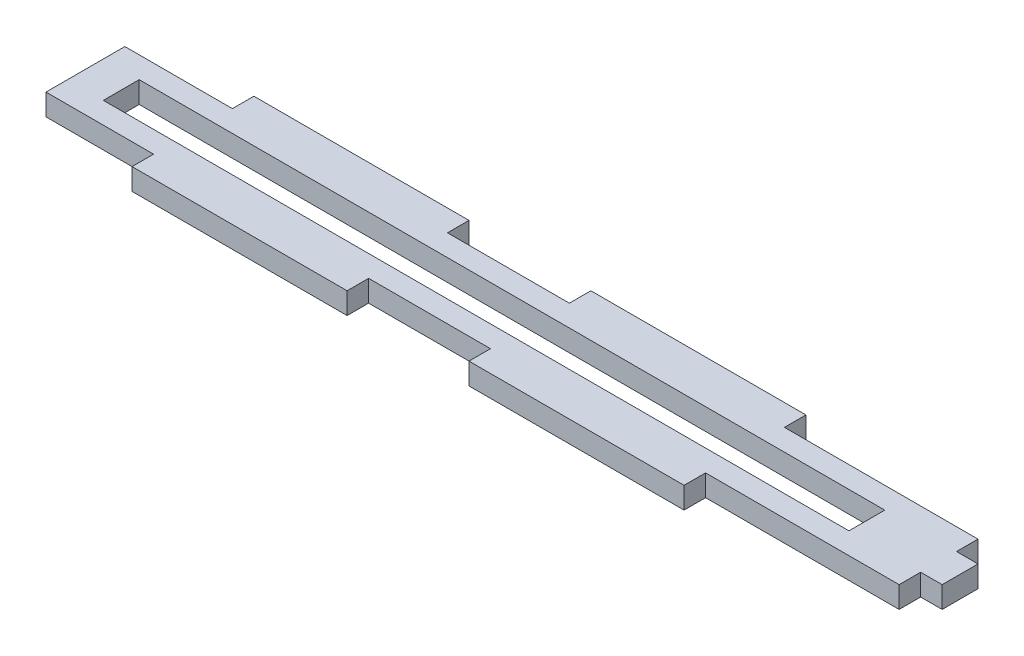
ISO-10303-21;
HEADER;
FILE_DESCRIPTION(('STEP AP214'),'2;1');
FILE_NAME('part.step','',(''),(''),'','','');
FILE_SCHEMA(('AUTOMOTIVE_DESIGN { 1 0 10303 214 1 1 1 1 }'));
ENDSEC;
DATA;
#1=APPLICATION_CONTEXT('core data for automotive mechanical design processes');
#2=APPLICATION_PROTOCOL_DEFINITION('international standard','automotive_design',2000,#1);
#3=PRODUCT_CONTEXT('',#1,'mechanical');
#4=PRODUCT('Part','Part','',(#3));
#5=PRODUCT_RELATED_PRODUCT_CATEGORY('part','',(#4));
#6=PRODUCT_DEFINITION_FORMATION('','',#4);
#7=PRODUCT_DEFINITION_CONTEXT('part definition',#1,'design');
#8=PRODUCT_DEFINITION('design','',#6,#7);
#9=PRODUCT_DEFINITION_SHAPE('','',#8);
#10=(LENGTH_UNIT() NAMED_UNIT(*) SI_UNIT(.MILLI.,.METRE.));
#11=(NAMED_UNIT(*) PLANE_ANGLE_UNIT() SI_UNIT($,.RADIAN.));
#12=(NAMED_UNIT(*) SI_UNIT($,.STERADIAN.) SOLID_ANGLE_UNIT());
#13=UNCERTAINTY_MEASURE_WITH_UNIT(LENGTH_MEASURE(1.E-05),#10,'distance_accuracy_value','');
#14=(GEOMETRIC_REPRESENTATION_CONTEXT(3) GLOBAL_UNCERTAINTY_ASSIGNED_CONTEXT((#13)) GLOBAL_UNIT_ASSIGNED_CONTEXT((#10,
#11,#12)) REPRESENTATION_CONTEXT('',''));
#15=CARTESIAN_POINT('',(0.,0.,0.));
#16=DIRECTION('',(0.,0.,1.));
#17=DIRECTION('',(1.,0.,0.));
#18=AXIS2_PLACEMENT_3D('',#15,#16,#17);
#19=CARTESIAN_POINT('',(59.5,1.5,-5.49999999999999));
#20=DIRECTION('',(-1.,0.,0.));
#21=DIRECTION('',(0.,0.,1.));
#22=AXIS2_PLACEMENT_3D('',#19,#20,#21);
#23=PLANE('',#22);
#24=DIRECTION('',(0.,-1.,0.));
#25=VECTOR('',#24,1.);
#26=CARTESIAN_POINT('',(59.5,1.5,2.49999999999998));
#27=LINE('',#26,#25);
#28=CARTESIAN_POINT('',(59.5,1.5,2.49999999999998));
#29=VERTEX_POINT('',#28);
#30=CARTESIAN_POINT('',(59.5,-1.5,2.49999999999998));
#31=VERTEX_POINT('',#30);
#32=EDGE_CURVE('E225',#29,#31,#27,.T.);
#33=ORIENTED_EDGE('',*,*,#32,.F.);
#34=DIRECTION('',(0.,0.,-1.));
#35=VECTOR('',#34,1.);
#36=CARTESIAN_POINT('',(59.5,1.5,-5.49999999999999));
#37=LINE('',#36,#35);
#38=CARTESIAN_POINT('',(59.5,1.5,5.49999999999999));
#39=VERTEX_POINT('',#38);
#40=EDGE_CURVE('E237',#39,#29,#37,.T.);
#41=ORIENTED_EDGE('',*,*,#40,.F.);
#42=DIRECTION('',(0.,-1.,0.));
#43=VECTOR('',#42,1.);
#44=CARTESIAN_POINT('',(59.5,1.5,5.49999999999999));
#45=LINE('',#44,#43);
#46=CARTESIAN_POINT('',(59.5,-1.5,5.49999999999999));
#47=VERTEX_POINT('',#46);
#48=EDGE_CURVE('E43',#39,#47,#45,.T.);
#49=ORIENTED_EDGE('',*,*,#48,.T.);
#50=DIRECTION('',(0.,0.,-1.));
#51=VECTOR('',#50,1.);
#52=CARTESIAN_POINT('',(59.5,-1.5,-5.49999999999999));
#53=LINE('',#52,#51);
#54=EDGE_CURVE('E239',#47,#31,#53,.T.);
#55=ORIENTED_EDGE('',*,*,#54,.T.);
#56=EDGE_LOOP('',(#33,#41,#49,#55));
#57=FACE_BOUND('',#56,.T.);
#58=ADVANCED_FACE('F35',(#57),#23,.F.);
#59=CARTESIAN_POINT('',(-59.5,1.5,-5.5));
#60=DIRECTION('',(0.,0.,1.));
#61=DIRECTION('',(1.,0.,0.));
#62=AXIS2_PLACEMENT_3D('',#59,#60,#61);
#63=PLANE('',#62);
#64=DIRECTION('',(0.,-1.,0.));
#65=VECTOR('',#64,1.);
#66=CARTESIAN_POINT('',(-14.5,1.5,-5.5));
#67=LINE('',#66,#65);
#68=CARTESIAN_POINT('',(-14.5,1.5,-5.5));
#69=VERTEX_POINT('',#68);
#70=CARTESIAN_POINT('',(-14.5,-1.5,-5.5));
#71=VERTEX_POINT('',#70);
#72=EDGE_CURVE('E353',#69,#71,#67,.T.);
#73=ORIENTED_EDGE('',*,*,#72,.F.);
#74=DIRECTION('',(-1.,0.,0.));
#75=VECTOR('',#74,1.);
#76=CARTESIAN_POINT('',(-59.5,1.5,-5.5));
#77=LINE('',#76,#75);
#78=CARTESIAN_POINT('',(2.5,1.5,-5.50000000000001));
#79=VERTEX_POINT('',#78);
#80=EDGE_CURVE('E249',#79,#69,#77,.T.);
#81=ORIENTED_EDGE('',*,*,#80,.F.);
#82=DIRECTION('',(0.,-1.,0.));
#83=VECTOR('',#82,1.);
#84=CARTESIAN_POINT('',(2.5,1.5,-5.50000000000001));
#85=LINE('',#84,#83);
#86=CARTESIAN_POINT('',(2.49999999999998,-1.5,-5.5));
#87=VERTEX_POINT('',#86);
#88=EDGE_CURVE('E364',#79,#87,#85,.T.);
#89=ORIENTED_EDGE('',*,*,#88,.T.);
#90=DIRECTION('',(-1.,0.,0.));
#91=VECTOR('',#90,1.);
#92=CARTESIAN_POINT('',(-59.5,-1.5,-5.5));
#93=LINE('',#92,#91);
#94=EDGE_CURVE('E274',#87,#71,#93,.T.);
#95=ORIENTED_EDGE('',*,*,#94,.T.);
#96=EDGE_LOOP('',(#73,#81,#89,#95));
#97=FACE_BOUND('',#96,.T.);
#98=ADVANCED_FACE('F475',(#97),#63,.F.);
#99=DIRECTION('',(0.,-1.,0.));
#100=VECTOR('',#99,1.);
#101=CARTESIAN_POINT('',(-44.5,1.5,-5.5));
#102=LINE('',#101,#100);
#103=CARTESIAN_POINT('',(-44.5,1.5,-5.5));
#104=VERTEX_POINT('',#103);
#105=CARTESIAN_POINT('',(-44.5,-1.5,-5.5));
#106=VERTEX_POINT('',#105);
#107=EDGE_CURVE('E339',#104,#106,#102,.T.);
#108=ORIENTED_EDGE('',*,*,#107,.T.);
#109=CARTESIAN_POINT('',(-59.5,-1.5,-5.5));
#110=VERTEX_POINT('',#109);
#111=EDGE_CURVE('E269',#106,#110,#93,.T.);
#112=ORIENTED_EDGE('',*,*,#111,.T.);
#113=DIRECTION('',(0.,-1.,0.));
#114=VECTOR('',#113,1.);
#115=CARTESIAN_POINT('',(-59.5,1.5,-5.5));
#116=LINE('',#115,#114);
#117=CARTESIAN_POINT('',(-59.5,1.5,-5.5));
#118=VERTEX_POINT('',#117);
#119=EDGE_CURVE('E257',#118,#110,#116,.T.);
#120=ORIENTED_EDGE('',*,*,#119,.F.);
#121=EDGE_CURVE('E246',#104,#118,#77,.T.);
#122=ORIENTED_EDGE('',*,*,#121,.F.);
#123=EDGE_LOOP('',(#108,#112,#120,#122));
#124=FACE_BOUND('',#123,.T.);
#125=ADVANCED_FACE('F472',(#124),#63,.F.);
#126=DIRECTION('',(0.,-1.,0.));
#127=VECTOR('',#126,1.);
#128=CARTESIAN_POINT('',(32.5,1.5,-5.5));
#129=LINE('',#128,#127);
#130=CARTESIAN_POINT('',(32.5,1.5,-5.5));
#131=VERTEX_POINT('',#130);
#132=CARTESIAN_POINT('',(32.5,-1.5,-5.5));
#133=VERTEX_POINT('',#132);
#134=EDGE_CURVE('E377',#131,#133,#129,.T.);
#135=ORIENTED_EDGE('',*,*,#134,.F.);
#136=CARTESIAN_POINT('',(59.5,1.5,-5.49999999999999));
#137=VERTEX_POINT('',#136);
#138=EDGE_CURVE('E251',#137,#131,#77,.T.);
#139=ORIENTED_EDGE('',*,*,#138,.F.);
#140=DIRECTION('',(0.,-1.,0.));
#141=VECTOR('',#140,1.);
#142=CARTESIAN_POINT('',(59.5,1.5,-5.49999999999999));
#143=LINE('',#142,#141);
#144=CARTESIAN_POINT('',(59.5,-1.5,-5.49999999999999));
#145=VERTEX_POINT('',#144);
#146=EDGE_CURVE('E277',#137,#145,#143,.T.);
#147=ORIENTED_EDGE('',*,*,#146,.T.);
#148=EDGE_CURVE('E270',#145,#133,#93,.T.);
#149=ORIENTED_EDGE('',*,*,#148,.T.);
#150=EDGE_LOOP('',(#135,#139,#147,#149));
#151=FACE_BOUND('',#150,.T.);
#152=ADVANCED_FACE('F467',(#151),#63,.F.);
#153=CARTESIAN_POINT('',(-59.5,1.5,5.5));
#154=DIRECTION('',(0.,0.,-1.));
#155=DIRECTION('',(-1.,0.,0.));
#156=AXIS2_PLACEMENT_3D('',#153,#154,#155);
#157=PLANE('',#156);
#158=DIRECTION('',(0.,-1.,0.));
#159=VECTOR('',#158,1.);
#160=CARTESIAN_POINT('',(32.5,1.5,5.5));
#161=LINE('',#160,#159);
#162=CARTESIAN_POINT('',(32.5,1.5,5.49999999999999));
#163=VERTEX_POINT('',#162);
#164=CARTESIAN_POINT('',(32.5,-1.5,5.5));
#165=VERTEX_POINT('',#164);
#166=EDGE_CURVE('E402',#163,#165,#161,.T.);
#167=ORIENTED_EDGE('',*,*,#166,.T.);
#168=DIRECTION('',(1.,0.,0.));
#169=VECTOR('',#168,1.);
#170=CARTESIAN_POINT('',(-59.5,-1.5,5.5));
#171=LINE('',#170,#169);
#172=EDGE_CURVE('E261',#165,#47,#171,.T.);
#173=ORIENTED_EDGE('',*,*,#172,.T.);
#174=ORIENTED_EDGE('',*,*,#48,.F.);
#175=DIRECTION('',(1.,0.,0.));
#176=VECTOR('',#175,1.);
#177=CARTESIAN_POINT('',(-59.5,1.5,5.5));
#178=LINE('',#177,#176);
#179=EDGE_CURVE('E244',#163,#39,#178,.T.);
#180=ORIENTED_EDGE('',*,*,#179,.F.);
#181=EDGE_LOOP('',(#167,#173,#174,#180));
#182=FACE_BOUND('',#181,.T.);
#183=ADVANCED_FACE('F465',(#182),#157,.F.);
#184=DIRECTION('',(0.,-1.,0.));
#185=VECTOR('',#184,1.);
#186=CARTESIAN_POINT('',(2.5,1.5,5.50000000000001));
#187=LINE('',#186,#185);
#188=CARTESIAN_POINT('',(2.49999999999998,1.5,5.5));
#189=VERTEX_POINT('',#188);
#190=CARTESIAN_POINT('',(2.49999999999998,-1.5,5.5));
#191=VERTEX_POINT('',#190);
#192=EDGE_CURVE('E399',#189,#191,#187,.T.);
#193=ORIENTED_EDGE('',*,*,#192,.F.);
#194=CARTESIAN_POINT('',(-14.5,1.5,5.5));
#195=VERTEX_POINT('',#194);
#196=EDGE_CURVE('E430',#195,#189,#178,.T.);
#197=ORIENTED_EDGE('',*,*,#196,.F.);
#198=DIRECTION('',(0.,-1.,0.));
#199=VECTOR('',#198,1.);
#200=CARTESIAN_POINT('',(-14.5,1.5,5.5));
#201=LINE('',#200,#199);
#202=CARTESIAN_POINT('',(-14.5,-1.5,5.5));
#203=VERTEX_POINT('',#202);
#204=EDGE_CURVE('E420',#195,#203,#201,.T.);
#205=ORIENTED_EDGE('',*,*,#204,.T.);
#206=EDGE_CURVE('E267',#203,#191,#171,.T.);
#207=ORIENTED_EDGE('',*,*,#206,.T.);
#208=EDGE_LOOP('',(#193,#197,#205,#207));
#209=FACE_BOUND('',#208,.T.);
#210=ADVANCED_FACE('F451',(#209),#157,.F.);
#211=DIRECTION('',(0.,-1.,0.));
#212=VECTOR('',#211,1.);
#213=CARTESIAN_POINT('',(-44.5,1.5,5.5));
#214=LINE('',#213,#212);
#215=CARTESIAN_POINT('',(-44.5,1.5,5.5));
#216=VERTEX_POINT('',#215);
#217=CARTESIAN_POINT('',(-44.5,-1.5,5.5));
#218=VERTEX_POINT('',#217);
#219=EDGE_CURVE('E413',#216,#218,#214,.T.);
#220=ORIENTED_EDGE('',*,*,#219,.F.);
#221=CARTESIAN_POINT('',(-59.5,1.5,5.5));
#222=VERTEX_POINT('',#221);
#223=EDGE_CURVE('E252',#222,#216,#178,.T.);
#224=ORIENTED_EDGE('',*,*,#223,.F.);
#225=DIRECTION('',(0.,-1.,0.));
#226=VECTOR('',#225,1.);
#227=CARTESIAN_POINT('',(-59.5,1.5,5.5));
#228=LINE('',#227,#226);
#229=CARTESIAN_POINT('',(-59.5,-1.5,5.5));
#230=VERTEX_POINT('',#229);
#231=EDGE_CURVE('E11',#222,#230,#228,.T.);
#232=ORIENTED_EDGE('',*,*,#231,.T.);
#233=EDGE_CURVE('E263',#230,#218,#171,.T.);
#234=ORIENTED_EDGE('',*,*,#233,.T.);
#235=EDGE_LOOP('',(#220,#224,#232,#234));
#236=FACE_BOUND('',#235,.T.);
#237=ADVANCED_FACE('F435',(#236),#157,.F.);
#238=CARTESIAN_POINT('',(-59.5,1.5,-5.5));
#239=DIRECTION('',(1.,0.,0.));
#240=DIRECTION('',(0.,0.,-1.));
#241=AXIS2_PLACEMENT_3D('',#238,#239,#240);
#242=PLANE('',#241);
#243=DIRECTION('',(0.,0.,1.));
#244=VECTOR('',#243,1.);
#245=CARTESIAN_POINT('',(-59.5,-1.5,-5.5));
#246=LINE('',#245,#244);
#247=EDGE_CURVE('E258',#110,#230,#246,.T.);
#248=ORIENTED_EDGE('',*,*,#247,.T.);
#249=ORIENTED_EDGE('',*,*,#231,.F.);
#250=DIRECTION('',(0.,0.,1.));
#251=VECTOR('',#250,1.);
#252=CARTESIAN_POINT('',(-59.5,1.5,-5.5));
#253=LINE('',#252,#251);
#254=EDGE_CURVE('E273',#118,#222,#253,.T.);
#255=ORIENTED_EDGE('',*,*,#254,.F.);
#256=ORIENTED_EDGE('',*,*,#119,.T.);
#257=EDGE_LOOP('',(#248,#249,#255,#256));
#258=FACE_BOUND('',#257,.T.);
#259=ADVANCED_FACE('F37',(#258),#242,.F.);
#260=CARTESIAN_POINT('',(59.5,1.5,-2.49999999999998));
#261=VERTEX_POINT('',#260);
#262=EDGE_CURVE('E247',#261,#137,#37,.T.);
#263=ORIENTED_EDGE('',*,*,#262,.F.);
#264=DIRECTION('',(0.,-1.,0.));
#265=VECTOR('',#264,1.);
#266=CARTESIAN_POINT('',(59.5,1.5,-2.49999999999998));
#267=LINE('',#266,#265);
#268=CARTESIAN_POINT('',(59.5,-1.5,-2.49999999999998));
#269=VERTEX_POINT('',#268);
#270=EDGE_CURVE('E295',#261,#269,#267,.T.);
#271=ORIENTED_EDGE('',*,*,#270,.T.);
#272=EDGE_CURVE('E266',#269,#145,#53,.T.);
#273=ORIENTED_EDGE('',*,*,#272,.T.);
#274=ORIENTED_EDGE('',*,*,#146,.F.);
#275=EDGE_LOOP('',(#263,#271,#273,#274));
#276=FACE_BOUND('',#275,.T.);
#277=ADVANCED_FACE('F479',(#276),#23,.F.);
#278=CARTESIAN_POINT('',(0.,1.5,0.));
#279=DIRECTION('',(0.,1.,0.));
#280=DIRECTION('',(0.,0.,1.));
#281=AXIS2_PLACEMENT_3D('',#278,#279,#280);
#282=PLANE('',#281);
#283=DIRECTION('',(0.,0.,1.));
#284=VECTOR('',#283,1.);
#285=CARTESIAN_POINT('',(-54.5,1.5,-2.5));
#286=LINE('',#285,#284);
#287=CARTESIAN_POINT('',(-54.5,1.5,-2.5));
#288=VERTEX_POINT('',#287);
#289=CARTESIAN_POINT('',(-54.5,1.5,2.5));
#290=VERTEX_POINT('',#289);
#291=EDGE_CURVE('E58',#288,#290,#286,.T.);
#292=ORIENTED_EDGE('',*,*,#291,.F.);
#293=DIRECTION('',(-1.,0.,0.));
#294=VECTOR('',#293,1.);
#295=CARTESIAN_POINT('',(-54.5,1.5,-2.5));
#296=LINE('',#295,#294);
#297=CARTESIAN_POINT('',(49.5,1.5,-2.5));
#298=VERTEX_POINT('',#297);
#299=EDGE_CURVE('E307',#298,#288,#296,.T.);
#300=ORIENTED_EDGE('',*,*,#299,.F.);
#301=DIRECTION('',(0.,0.,-1.));
#302=VECTOR('',#301,1.);
#303=CARTESIAN_POINT('',(49.5,1.5,-2.5));
#304=LINE('',#303,#302);
#305=CARTESIAN_POINT('',(49.5,1.5,2.5));
#306=VERTEX_POINT('',#305);
#307=EDGE_CURVE('E304',#306,#298,#304,.T.);
#308=ORIENTED_EDGE('',*,*,#307,.F.);
#309=DIRECTION('',(1.,0.,0.));
#310=VECTOR('',#309,1.);
#311=CARTESIAN_POINT('',(-54.5,1.5,2.5));
#312=LINE('',#311,#310);
#313=EDGE_CURVE('E301',#290,#306,#312,.T.);
#314=ORIENTED_EDGE('',*,*,#313,.F.);
#315=EDGE_LOOP('',(#292,#300,#308,#314));
#316=FACE_BOUND('',#315,.T.);
#317=ORIENTED_EDGE('',*,*,#254,.T.);
#318=ORIENTED_EDGE('',*,*,#223,.T.);
#319=DIRECTION('',(0.,0.,1.));
#320=VECTOR('',#319,1.);
#321=CARTESIAN_POINT('',(-44.5,1.5,5.5));
#322=LINE('',#321,#320);
#323=CARTESIAN_POINT('',(-44.5,1.5,8.5));
#324=VERTEX_POINT('',#323);
#325=EDGE_CURVE('E405',#216,#324,#322,.T.);
#326=ORIENTED_EDGE('',*,*,#325,.T.);
#327=DIRECTION('',(1.,0.,0.));
#328=VECTOR('',#327,1.);
#329=CARTESIAN_POINT('',(-44.5,1.5,8.5));
#330=LINE('',#329,#328);
#331=CARTESIAN_POINT('',(-14.5,1.5,8.5));
#332=VERTEX_POINT('',#331);
#333=EDGE_CURVE('E408',#324,#332,#330,.T.);
#334=ORIENTED_EDGE('',*,*,#333,.T.);
#335=DIRECTION('',(0.,0.,-1.));
#336=VECTOR('',#335,1.);
#337=CARTESIAN_POINT('',(-14.5,1.5,5.5));
#338=LINE('',#337,#336);
#339=EDGE_CURVE('E411',#332,#195,#338,.T.);
#340=ORIENTED_EDGE('',*,*,#339,.T.);
#341=ORIENTED_EDGE('',*,*,#196,.T.);
#342=DIRECTION('',(0.,0.,1.));
#343=VECTOR('',#342,1.);
#344=CARTESIAN_POINT('',(2.5,1.5,5.50000000000001));
#345=LINE('',#344,#343);
#346=CARTESIAN_POINT('',(2.49999999999999,1.5,8.50000000000001));
#347=VERTEX_POINT('',#346);
#348=EDGE_CURVE('E383',#189,#347,#345,.T.);
#349=ORIENTED_EDGE('',*,*,#348,.T.);
#350=DIRECTION('',(1.,0.,0.));
#351=VECTOR('',#350,1.);
#352=CARTESIAN_POINT('',(32.5,1.5,8.5));
#353=LINE('',#352,#351);
#354=CARTESIAN_POINT('',(32.5,1.5,8.5));
#355=VERTEX_POINT('',#354);
#356=EDGE_CURVE('E386',#347,#355,#353,.T.);
#357=ORIENTED_EDGE('',*,*,#356,.T.);
#358=DIRECTION('',(0.,0.,-1.));
#359=VECTOR('',#358,1.);
#360=CARTESIAN_POINT('',(32.5,1.5,5.5));
#361=LINE('',#360,#359);
#362=EDGE_CURVE('E381',#355,#163,#361,.T.);
#363=ORIENTED_EDGE('',*,*,#362,.T.);
#364=ORIENTED_EDGE('',*,*,#179,.T.);
#365=ORIENTED_EDGE('',*,*,#40,.T.);
#366=DIRECTION('',(1.,0.,0.));
#367=VECTOR('',#366,1.);
#368=CARTESIAN_POINT('',(59.5,1.5,2.49999999999998));
#369=LINE('',#368,#367);
#370=CARTESIAN_POINT('',(62.5,1.5,2.50000000000002));
#371=VERTEX_POINT('',#370);
#372=EDGE_CURVE('E222',#29,#371,#369,.T.);
#373=ORIENTED_EDGE('',*,*,#372,.T.);
#374=DIRECTION('',(0.,0.,-1.));
#375=VECTOR('',#374,1.);
#376=CARTESIAN_POINT('',(62.5,1.5,-2.49999999999998));
#377=LINE('',#376,#375);
#378=CARTESIAN_POINT('',(62.5,1.5,-2.49999999999998));
#379=VERTEX_POINT('',#378);
#380=EDGE_CURVE('E232',#371,#379,#377,.T.);
#381=ORIENTED_EDGE('',*,*,#380,.T.);
#382=DIRECTION('',(-1.,0.,0.));
#383=VECTOR('',#382,1.);
#384=CARTESIAN_POINT('',(59.5,1.5,-2.49999999999998));
#385=LINE('',#384,#383);
#386=EDGE_CURVE('E291',#379,#261,#385,.T.);
#387=ORIENTED_EDGE('',*,*,#386,.T.);
#388=ORIENTED_EDGE('',*,*,#262,.T.);
#389=ORIENTED_EDGE('',*,*,#138,.T.);
#390=DIRECTION('',(0.,0.,-1.));
#391=VECTOR('',#390,1.);
#392=CARTESIAN_POINT('',(32.5,1.5,-5.5));
#393=LINE('',#392,#391);
#394=CARTESIAN_POINT('',(32.5,1.5,-8.5));
#395=VERTEX_POINT('',#394);
#396=EDGE_CURVE('E357',#131,#395,#393,.T.);
#397=ORIENTED_EDGE('',*,*,#396,.T.);
#398=DIRECTION('',(-1.,0.,0.));
#399=VECTOR('',#398,1.);
#400=CARTESIAN_POINT('',(32.5,1.5,-8.5));
#401=LINE('',#400,#399);
#402=CARTESIAN_POINT('',(2.49999999999999,1.5,-8.50000000000001));
#403=VERTEX_POINT('',#402);
#404=EDGE_CURVE('E359',#395,#403,#401,.T.);
#405=ORIENTED_EDGE('',*,*,#404,.T.);
#406=DIRECTION('',(0.,0.,1.));
#407=VECTOR('',#406,1.);
#408=CARTESIAN_POINT('',(2.5,1.5,-5.50000000000001));
#409=LINE('',#408,#407);
#410=EDGE_CURVE('E362',#403,#79,#409,.T.);
#411=ORIENTED_EDGE('',*,*,#410,.T.);
#412=ORIENTED_EDGE('',*,*,#80,.T.);
#413=DIRECTION('',(0.,0.,-1.));
#414=VECTOR('',#413,1.);
#415=CARTESIAN_POINT('',(-14.5,1.5,-5.5));
#416=LINE('',#415,#414);
#417=CARTESIAN_POINT('',(-14.5,1.5,-8.5));
#418=VERTEX_POINT('',#417);
#419=EDGE_CURVE('E331',#69,#418,#416,.T.);
#420=ORIENTED_EDGE('',*,*,#419,.T.);
#421=DIRECTION('',(-1.,0.,0.));
#422=VECTOR('',#421,1.);
#423=CARTESIAN_POINT('',(-44.5,1.5,-8.5));
#424=LINE('',#423,#422);
#425=CARTESIAN_POINT('',(-44.5,1.5,-8.5));
#426=VERTEX_POINT('',#425);
#427=EDGE_CURVE('E333',#418,#426,#424,.T.);
#428=ORIENTED_EDGE('',*,*,#427,.T.);
#429=DIRECTION('',(0.,0.,1.));
#430=VECTOR('',#429,1.);
#431=CARTESIAN_POINT('',(-44.5,1.5,-5.5));
#432=LINE('',#431,#430);
#433=EDGE_CURVE('E336',#426,#104,#432,.T.);
#434=ORIENTED_EDGE('',*,*,#433,.T.);
#435=ORIENTED_EDGE('',*,*,#121,.T.);
#436=EDGE_LOOP('',(#317,#318,#326,#334,#340,#341,#349,#357,#363,#364,#365,#373,#381,#387,#388,
#389,#397,#405,#411,#412,#420,#428,#434,#435));
#437=FACE_BOUND('',#436,.T.);
#438=ADVANCED_FACE('F242',(#316,#437),#282,.T.);
#439=CARTESIAN_POINT('',(0.,-1.5,0.));
#440=DIRECTION('',(0.,1.,0.));
#441=DIRECTION('',(0.,0.,1.));
#442=AXIS2_PLACEMENT_3D('',#439,#440,#441);
#443=PLANE('',#442);
#444=DIRECTION('',(-1.,0.,0.));
#445=VECTOR('',#444,1.);
#446=CARTESIAN_POINT('',(-54.5,-1.5,-2.5));
#447=LINE('',#446,#445);
#448=CARTESIAN_POINT('',(49.5,-1.5,-2.5));
#449=VERTEX_POINT('',#448);
#450=CARTESIAN_POINT('',(-54.5,-1.5,-2.5));
#451=VERTEX_POINT('',#450);
#452=EDGE_CURVE('E319',#449,#451,#447,.T.);
#453=ORIENTED_EDGE('',*,*,#452,.T.);
#454=DIRECTION('',(0.,0.,1.));
#455=VECTOR('',#454,1.);
#456=CARTESIAN_POINT('',(-54.5,-1.5,-2.5));
#457=LINE('',#456,#455);
#458=CARTESIAN_POINT('',(-54.5,-1.5,2.5));
#459=VERTEX_POINT('',#458);
#460=EDGE_CURVE('E310',#451,#459,#457,.T.);
#461=ORIENTED_EDGE('',*,*,#460,.T.);
#462=DIRECTION('',(1.,0.,0.));
#463=VECTOR('',#462,1.);
#464=CARTESIAN_POINT('',(-54.5,-1.5,2.5));
#465=LINE('',#464,#463);
#466=CARTESIAN_POINT('',(49.5,-1.5,2.5));
#467=VERTEX_POINT('',#466);
#468=EDGE_CURVE('E313',#459,#467,#465,.T.);
#469=ORIENTED_EDGE('',*,*,#468,.T.);
#470=DIRECTION('',(0.,0.,-1.));
#471=VECTOR('',#470,1.);
#472=CARTESIAN_POINT('',(49.5,-1.5,-2.5));
#473=LINE('',#472,#471);
#474=EDGE_CURVE('E316',#467,#449,#473,.T.);
#475=ORIENTED_EDGE('',*,*,#474,.T.);
#476=EDGE_LOOP('',(#453,#461,#469,#475));
#477=FACE_BOUND('',#476,.T.);
#478=ORIENTED_EDGE('',*,*,#247,.F.);
#479=ORIENTED_EDGE('',*,*,#111,.F.);
#480=DIRECTION('',(0.,0.,1.));
#481=VECTOR('',#480,1.);
#482=CARTESIAN_POINT('',(-44.5,-1.5,-5.5));
#483=LINE('',#482,#481);
#484=CARTESIAN_POINT('',(-44.5,-1.5,-8.5));
#485=VERTEX_POINT('',#484);
#486=EDGE_CURVE('E334',#485,#106,#483,.T.);
#487=ORIENTED_EDGE('',*,*,#486,.F.);
#488=DIRECTION('',(-1.,0.,0.));
#489=VECTOR('',#488,1.);
#490=CARTESIAN_POINT('',(-44.5,-1.5,-8.5));
#491=LINE('',#490,#489);
#492=CARTESIAN_POINT('',(-14.5,-1.5,-8.5));
#493=VERTEX_POINT('',#492);
#494=EDGE_CURVE('E341',#493,#485,#491,.T.);
#495=ORIENTED_EDGE('',*,*,#494,.F.);
#496=DIRECTION('',(0.,0.,-1.));
#497=VECTOR('',#496,1.);
#498=CARTESIAN_POINT('',(-14.5,-1.5,-5.5));
#499=LINE('',#498,#497);
#500=EDGE_CURVE('E325',#71,#493,#499,.T.);
#501=ORIENTED_EDGE('',*,*,#500,.F.);
#502=ORIENTED_EDGE('',*,*,#94,.F.);
#503=DIRECTION('',(0.,0.,1.));
#504=VECTOR('',#503,1.);
#505=CARTESIAN_POINT('',(2.5,-1.5,-5.50000000000001));
#506=LINE('',#505,#504);
#507=CARTESIAN_POINT('',(2.49999999999999,-1.5,-8.50000000000001));
#508=VERTEX_POINT('',#507);
#509=EDGE_CURVE('E360',#508,#87,#506,.T.);
#510=ORIENTED_EDGE('',*,*,#509,.F.);
#511=DIRECTION('',(-1.,0.,0.));
#512=VECTOR('',#511,1.);
#513=CARTESIAN_POINT('',(32.5,-1.5,-8.5));
#514=LINE('',#513,#512);
#515=CARTESIAN_POINT('',(32.5,-1.5,-8.5));
#516=VERTEX_POINT('',#515);
#517=EDGE_CURVE('E366',#516,#508,#514,.T.);
#518=ORIENTED_EDGE('',*,*,#517,.F.);
#519=DIRECTION('',(0.,0.,-1.));
#520=VECTOR('',#519,1.);
#521=CARTESIAN_POINT('',(32.5,-1.5,-5.5));
#522=LINE('',#521,#520);
#523=EDGE_CURVE('E356',#133,#516,#522,.T.);
#524=ORIENTED_EDGE('',*,*,#523,.F.);
#525=ORIENTED_EDGE('',*,*,#148,.F.);
#526=ORIENTED_EDGE('',*,*,#272,.F.);
#527=DIRECTION('',(-1.,0.,0.));
#528=VECTOR('',#527,1.);
#529=CARTESIAN_POINT('',(59.5,-1.5,-2.49999999999998));
#530=LINE('',#529,#528);
#531=CARTESIAN_POINT('',(62.5,-1.5,-2.49999999999998));
#532=VERTEX_POINT('',#531);
#533=EDGE_CURVE('E50',#532,#269,#530,.T.);
#534=ORIENTED_EDGE('',*,*,#533,.F.);
#535=DIRECTION('',(0.,0.,-1.));
#536=VECTOR('',#535,1.);
#537=CARTESIAN_POINT('',(62.5,-1.5,-2.49999999999998));
#538=LINE('',#537,#536);
#539=CARTESIAN_POINT('',(62.5,-1.5,2.50000000000002));
#540=VERTEX_POINT('',#539);
#541=EDGE_CURVE('E287',#540,#532,#538,.T.);
#542=ORIENTED_EDGE('',*,*,#541,.F.);
#543=DIRECTION('',(1.,0.,0.));
#544=VECTOR('',#543,1.);
#545=CARTESIAN_POINT('',(59.5,-1.5,2.49999999999998));
#546=LINE('',#545,#544);
#547=EDGE_CURVE('E286',#31,#540,#546,.T.);
#548=ORIENTED_EDGE('',*,*,#547,.F.);
#549=ORIENTED_EDGE('',*,*,#54,.F.);
#550=ORIENTED_EDGE('',*,*,#172,.F.);
#551=DIRECTION('',(0.,0.,-1.));
#552=VECTOR('',#551,1.);
#553=CARTESIAN_POINT('',(32.5,-1.5,5.5));
#554=LINE('',#553,#552);
#555=CARTESIAN_POINT('',(32.5,-1.5,8.5));
#556=VERTEX_POINT('',#555);
#557=EDGE_CURVE('E380',#556,#165,#554,.T.);
#558=ORIENTED_EDGE('',*,*,#557,.F.);
#559=DIRECTION('',(1.,0.,0.));
#560=VECTOR('',#559,1.);
#561=CARTESIAN_POINT('',(32.5,-1.5,8.5));
#562=LINE('',#561,#560);
#563=CARTESIAN_POINT('',(2.49999999999999,-1.5,8.50000000000001));
#564=VERTEX_POINT('',#563);
#565=EDGE_CURVE('E384',#564,#556,#562,.T.);
#566=ORIENTED_EDGE('',*,*,#565,.F.);
#567=DIRECTION('',(0.,0.,1.));
#568=VECTOR('',#567,1.);
#569=CARTESIAN_POINT('',(2.5,-1.5,5.50000000000001));
#570=LINE('',#569,#568);
#571=EDGE_CURVE('E391',#191,#564,#570,.T.);
#572=ORIENTED_EDGE('',*,*,#571,.F.);
#573=ORIENTED_EDGE('',*,*,#206,.F.);
#574=DIRECTION('',(0.,0.,-1.));
#575=VECTOR('',#574,1.);
#576=CARTESIAN_POINT('',(-14.5,-1.5,5.5));
#577=LINE('',#576,#575);
#578=CARTESIAN_POINT('',(-14.5,-1.5,8.5));
#579=VERTEX_POINT('',#578);
#580=EDGE_CURVE('E409',#579,#203,#577,.T.);
#581=ORIENTED_EDGE('',*,*,#580,.F.);
#582=DIRECTION('',(1.,0.,0.));
#583=VECTOR('',#582,1.);
#584=CARTESIAN_POINT('',(-44.5,-1.5,8.5));
#585=LINE('',#584,#583);
#586=CARTESIAN_POINT('',(-44.5,-1.5,8.5));
#587=VERTEX_POINT('',#586);
#588=EDGE_CURVE('E416',#587,#579,#585,.T.);
#589=ORIENTED_EDGE('',*,*,#588,.F.);
#590=DIRECTION('',(0.,0.,1.));
#591=VECTOR('',#590,1.);
#592=CARTESIAN_POINT('',(-44.5,-1.5,5.5));
#593=LINE('',#592,#591);
#594=EDGE_CURVE('E404',#218,#587,#593,.T.);
#595=ORIENTED_EDGE('',*,*,#594,.F.);
#596=ORIENTED_EDGE('',*,*,#233,.F.);
#597=EDGE_LOOP('',(#478,#479,#487,#495,#501,#502,#510,#518,#524,#525,#526,#534,#542,#548,#549,
#550,#558,#566,#572,#573,#581,#589,#595,#596));
#598=FACE_BOUND('',#597,.T.);
#599=ADVANCED_FACE('F282',(#477,#598),#443,.F.);
#600=CARTESIAN_POINT('',(-44.5,1.5,5.5));
#601=DIRECTION('',(1.,0.,0.));
#602=DIRECTION('',(0.,0.,-1.));
#603=AXIS2_PLACEMENT_3D('',#600,#601,#602);
#604=PLANE('',#603);
#605=ORIENTED_EDGE('',*,*,#594,.T.);
#606=DIRECTION('',(0.,-1.,0.));
#607=VECTOR('',#606,1.);
#608=CARTESIAN_POINT('',(-44.5,1.5,8.5));
#609=LINE('',#608,#607);
#610=EDGE_CURVE('E262',#324,#587,#609,.T.);
#611=ORIENTED_EDGE('',*,*,#610,.F.);
#612=ORIENTED_EDGE('',*,*,#325,.F.);
#613=ORIENTED_EDGE('',*,*,#219,.T.);
#614=EDGE_LOOP('',(#605,#611,#612,#613));
#615=FACE_BOUND('',#614,.T.);
#616=ADVANCED_FACE('F438',(#615),#604,.F.);
#617=CARTESIAN_POINT('',(-44.5,1.5,8.5));
#618=DIRECTION('',(0.,0.,-1.));
#619=DIRECTION('',(-1.,0.,0.));
#620=AXIS2_PLACEMENT_3D('',#617,#618,#619);
#621=PLANE('',#620);
#622=ORIENTED_EDGE('',*,*,#588,.T.);
#623=DIRECTION('',(0.,-1.,0.));
#624=VECTOR('',#623,1.);
#625=CARTESIAN_POINT('',(-14.5,1.5,8.5));
#626=LINE('',#625,#624);
#627=EDGE_CURVE('E423',#332,#579,#626,.T.);
#628=ORIENTED_EDGE('',*,*,#627,.F.);
#629=ORIENTED_EDGE('',*,*,#333,.F.);
#630=ORIENTED_EDGE('',*,*,#610,.T.);
#631=EDGE_LOOP('',(#622,#628,#629,#630));
#632=FACE_BOUND('',#631,.T.);
#633=ADVANCED_FACE('F443',(#632),#621,.F.);
#634=CARTESIAN_POINT('',(-14.5,1.5,5.5));
#635=DIRECTION('',(-1.,0.,0.));
#636=DIRECTION('',(0.,0.,1.));
#637=AXIS2_PLACEMENT_3D('',#634,#635,#636);
#638=PLANE('',#637);
#639=ORIENTED_EDGE('',*,*,#580,.T.);
#640=ORIENTED_EDGE('',*,*,#204,.F.);
#641=ORIENTED_EDGE('',*,*,#339,.F.);
#642=ORIENTED_EDGE('',*,*,#627,.T.);
#643=EDGE_LOOP('',(#639,#640,#641,#642));
#644=FACE_BOUND('',#643,.T.);
#645=ADVANCED_FACE('F449',(#644),#638,.F.);
#646=CARTESIAN_POINT('',(32.5,1.5,5.5));
#647=DIRECTION('',(-1.,0.,0.));
#648=DIRECTION('',(0.,0.,1.));
#649=AXIS2_PLACEMENT_3D('',#646,#647,#648);
#650=PLANE('',#649);
#651=ORIENTED_EDGE('',*,*,#557,.T.);
#652=ORIENTED_EDGE('',*,*,#166,.F.);
#653=ORIENTED_EDGE('',*,*,#362,.F.);
#654=DIRECTION('',(0.,-1.,0.));
#655=VECTOR('',#654,1.);
#656=CARTESIAN_POINT('',(32.5,1.5,8.5));
#657=LINE('',#656,#655);
#658=EDGE_CURVE('E388',#355,#556,#657,.T.);
#659=ORIENTED_EDGE('',*,*,#658,.T.);
#660=EDGE_LOOP('',(#651,#652,#653,#659));
#661=FACE_BOUND('',#660,.T.);
#662=ADVANCED_FACE('F463',(#661),#650,.F.);
#663=CARTESIAN_POINT('',(2.5,1.5,5.50000000000001));
#664=DIRECTION('',(1.,0.,0.));
#665=DIRECTION('',(0.,0.,-1.));
#666=AXIS2_PLACEMENT_3D('',#663,#664,#665);
#667=PLANE('',#666);
#668=ORIENTED_EDGE('',*,*,#571,.T.);
#669=DIRECTION('',(0.,-1.,0.));
#670=VECTOR('',#669,1.);
#671=CARTESIAN_POINT('',(2.49999999999999,1.5,8.50000000000001));
#672=LINE('',#671,#670);
#673=EDGE_CURVE('E396',#347,#564,#672,.T.);
#674=ORIENTED_EDGE('',*,*,#673,.F.);
#675=ORIENTED_EDGE('',*,*,#348,.F.);
#676=ORIENTED_EDGE('',*,*,#192,.T.);
#677=EDGE_LOOP('',(#668,#674,#675,#676));
#678=FACE_BOUND('',#677,.T.);
#679=ADVANCED_FACE('F454',(#678),#667,.F.);
#680=CARTESIAN_POINT('',(32.5,1.5,8.5));
#681=DIRECTION('',(0.,0.,-1.));
#682=DIRECTION('',(-1.,0.,0.));
#683=AXIS2_PLACEMENT_3D('',#680,#681,#682);
#684=PLANE('',#683);
#685=ORIENTED_EDGE('',*,*,#565,.T.);
#686=ORIENTED_EDGE('',*,*,#658,.F.);
#687=ORIENTED_EDGE('',*,*,#356,.F.);
#688=ORIENTED_EDGE('',*,*,#673,.T.);
#689=EDGE_LOOP('',(#685,#686,#687,#688));
#690=FACE_BOUND('',#689,.T.);
#691=ADVANCED_FACE('F459',(#690),#684,.F.);
#692=CARTESIAN_POINT('',(32.5,1.5,-5.5));
#693=DIRECTION('',(-1.,0.,0.));
#694=DIRECTION('',(0.,0.,1.));
#695=AXIS2_PLACEMENT_3D('',#692,#693,#694);
#696=PLANE('',#695);
#697=ORIENTED_EDGE('',*,*,#523,.T.);
#698=DIRECTION('',(0.,-1.,0.));
#699=VECTOR('',#698,1.);
#700=CARTESIAN_POINT('',(32.5,1.5,-8.5));
#701=LINE('',#700,#699);
#702=EDGE_CURVE('E374',#395,#516,#701,.T.);
#703=ORIENTED_EDGE('',*,*,#702,.F.);
#704=ORIENTED_EDGE('',*,*,#396,.F.);
#705=ORIENTED_EDGE('',*,*,#134,.T.);
#706=EDGE_LOOP('',(#697,#703,#704,#705));
#707=FACE_BOUND('',#706,.T.);
#708=ADVANCED_FACE('F545',(#707),#696,.F.);
#709=CARTESIAN_POINT('',(32.5,1.5,-8.5));
#710=DIRECTION('',(0.,0.,1.));
#711=DIRECTION('',(1.,0.,0.));
#712=AXIS2_PLACEMENT_3D('',#709,#710,#711);
#713=PLANE('',#712);
#714=ORIENTED_EDGE('',*,*,#517,.T.);
#715=DIRECTION('',(0.,-1.,0.));
#716=VECTOR('',#715,1.);
#717=CARTESIAN_POINT('',(2.49999999999999,1.5,-8.50000000000001));
#718=LINE('',#717,#716);
#719=EDGE_CURVE('E371',#403,#508,#718,.T.);
#720=ORIENTED_EDGE('',*,*,#719,.F.);
#721=ORIENTED_EDGE('',*,*,#404,.F.);
#722=ORIENTED_EDGE('',*,*,#702,.T.);
#723=EDGE_LOOP('',(#714,#720,#721,#722));
#724=FACE_BOUND('',#723,.T.);
#725=ADVANCED_FACE('F541',(#724),#713,.F.);
#726=CARTESIAN_POINT('',(2.5,1.5,-5.50000000000001));
#727=DIRECTION('',(1.,0.,0.));
#728=DIRECTION('',(0.,0.,-1.));
#729=AXIS2_PLACEMENT_3D('',#726,#727,#728);
#730=PLANE('',#729);
#731=ORIENTED_EDGE('',*,*,#509,.T.);
#732=ORIENTED_EDGE('',*,*,#88,.F.);
#733=ORIENTED_EDGE('',*,*,#410,.F.);
#734=ORIENTED_EDGE('',*,*,#719,.T.);
#735=EDGE_LOOP('',(#731,#732,#733,#734));
#736=FACE_BOUND('',#735,.T.);
#737=ADVANCED_FACE('F537',(#736),#730,.F.);
#738=CARTESIAN_POINT('',(-14.5,1.5,-5.5));
#739=DIRECTION('',(-1.,0.,0.));
#740=DIRECTION('',(0.,0.,1.));
#741=AXIS2_PLACEMENT_3D('',#738,#739,#740);
#742=PLANE('',#741);
#743=ORIENTED_EDGE('',*,*,#500,.T.);
#744=DIRECTION('',(0.,-1.,0.));
#745=VECTOR('',#744,1.);
#746=CARTESIAN_POINT('',(-14.5,1.5,-8.5));
#747=LINE('',#746,#745);
#748=EDGE_CURVE('E350',#418,#493,#747,.T.);
#749=ORIENTED_EDGE('',*,*,#748,.F.);
#750=ORIENTED_EDGE('',*,*,#419,.F.);
#751=ORIENTED_EDGE('',*,*,#72,.T.);
#752=EDGE_LOOP('',(#743,#749,#750,#751));
#753=FACE_BOUND('',#752,.T.);
#754=ADVANCED_FACE('F533',(#753),#742,.F.);
#755=CARTESIAN_POINT('',(-44.5,1.5,-8.5));
#756=DIRECTION('',(0.,0.,1.));
#757=DIRECTION('',(1.,0.,0.));
#758=AXIS2_PLACEMENT_3D('',#755,#756,#757);
#759=PLANE('',#758);
#760=ORIENTED_EDGE('',*,*,#494,.T.);
#761=DIRECTION('',(0.,-1.,0.));
#762=VECTOR('',#761,1.);
#763=CARTESIAN_POINT('',(-44.5,1.5,-8.5));
#764=LINE('',#763,#762);
#765=EDGE_CURVE('E347',#426,#485,#764,.T.);
#766=ORIENTED_EDGE('',*,*,#765,.F.);
#767=ORIENTED_EDGE('',*,*,#427,.F.);
#768=ORIENTED_EDGE('',*,*,#748,.T.);
#769=EDGE_LOOP('',(#760,#766,#767,#768));
#770=FACE_BOUND('',#769,.T.);
#771=ADVANCED_FACE('F529',(#770),#759,.F.);
#772=CARTESIAN_POINT('',(-44.5,1.5,-5.5));
#773=DIRECTION('',(1.,0.,0.));
#774=DIRECTION('',(0.,0.,-1.));
#775=AXIS2_PLACEMENT_3D('',#772,#773,#774);
#776=PLANE('',#775);
#777=ORIENTED_EDGE('',*,*,#486,.T.);
#778=ORIENTED_EDGE('',*,*,#107,.F.);
#779=ORIENTED_EDGE('',*,*,#433,.F.);
#780=ORIENTED_EDGE('',*,*,#765,.T.);
#781=EDGE_LOOP('',(#777,#778,#779,#780));
#782=FACE_BOUND('',#781,.T.);
#783=ADVANCED_FACE('F526',(#782),#776,.F.);
#784=CARTESIAN_POINT('',(-54.5,-1.5,-2.5));
#785=DIRECTION('',(-1.,0.,0.));
#786=DIRECTION('',(0.,0.,1.));
#787=AXIS2_PLACEMENT_3D('',#784,#785,#786);
#788=PLANE('',#787);
#789=DIRECTION('',(0.,1.,0.));
#790=VECTOR('',#789,1.);
#791=CARTESIAN_POINT('',(-54.5,-1.5,2.5));
#792=LINE('',#791,#790);
#793=EDGE_CURVE('E322',#459,#290,#792,.T.);
#794=ORIENTED_EDGE('',*,*,#793,.F.);
#795=ORIENTED_EDGE('',*,*,#460,.F.);
#796=DIRECTION('',(0.,1.,0.));
#797=VECTOR('',#796,1.);
#798=CARTESIAN_POINT('',(-54.5,-1.5,-2.5));
#799=LINE('',#798,#797);
#800=EDGE_CURVE('E323',#451,#288,#799,.T.);
#801=ORIENTED_EDGE('',*,*,#800,.T.);
#802=ORIENTED_EDGE('',*,*,#291,.T.);
#803=EDGE_LOOP('',(#794,#795,#801,#802));
#804=FACE_BOUND('',#803,.T.);
#805=ADVANCED_FACE('F516',(#804),#788,.F.);
#806=CARTESIAN_POINT('',(-54.5,-1.5,-2.5));
#807=DIRECTION('',(0.,0.,-1.));
#808=DIRECTION('',(-1.,0.,0.));
#809=AXIS2_PLACEMENT_3D('',#806,#807,#808);
#810=PLANE('',#809);
#811=ORIENTED_EDGE('',*,*,#800,.F.);
#812=ORIENTED_EDGE('',*,*,#452,.F.);
#813=DIRECTION('',(0.,1.,0.));
#814=VECTOR('',#813,1.);
#815=CARTESIAN_POINT('',(49.5,-1.5,-2.5));
#816=LINE('',#815,#814);
#817=EDGE_CURVE('E326',#449,#298,#816,.T.);
#818=ORIENTED_EDGE('',*,*,#817,.T.);
#819=ORIENTED_EDGE('',*,*,#299,.T.);
#820=EDGE_LOOP('',(#811,#812,#818,#819));
#821=FACE_BOUND('',#820,.T.);
#822=ADVANCED_FACE('F512',(#821),#810,.F.);
#823=CARTESIAN_POINT('',(49.5,-1.5,-2.5));
#824=DIRECTION('',(1.,0.,0.));
#825=DIRECTION('',(0.,0.,-1.));
#826=AXIS2_PLACEMENT_3D('',#823,#824,#825);
#827=PLANE('',#826);
#828=ORIENTED_EDGE('',*,*,#817,.F.);
#829=ORIENTED_EDGE('',*,*,#474,.F.);
#830=DIRECTION('',(0.,1.,0.));
#831=VECTOR('',#830,1.);
#832=CARTESIAN_POINT('',(49.5,-1.5,2.5));
#833=LINE('',#832,#831);
#834=EDGE_CURVE('E328',#467,#306,#833,.T.);
#835=ORIENTED_EDGE('',*,*,#834,.T.);
#836=ORIENTED_EDGE('',*,*,#307,.T.);
#837=EDGE_LOOP('',(#828,#829,#835,#836));
#838=FACE_BOUND('',#837,.T.);
#839=ADVANCED_FACE('F515',(#838),#827,.F.);
#840=CARTESIAN_POINT('',(-54.5,-1.5,2.5));
#841=DIRECTION('',(0.,0.,1.));
#842=DIRECTION('',(1.,0.,0.));
#843=AXIS2_PLACEMENT_3D('',#840,#841,#842);
#844=PLANE('',#843);
#845=ORIENTED_EDGE('',*,*,#834,.F.);
#846=ORIENTED_EDGE('',*,*,#468,.F.);
#847=ORIENTED_EDGE('',*,*,#793,.T.);
#848=ORIENTED_EDGE('',*,*,#313,.T.);
#849=EDGE_LOOP('',(#845,#846,#847,#848));
#850=FACE_BOUND('',#849,.T.);
#851=ADVANCED_FACE('F511',(#850),#844,.F.);
#852=CARTESIAN_POINT('',(59.5,1.5,2.49999999999998));
#853=DIRECTION('',(0.,0.,-1.));
#854=DIRECTION('',(-1.,0.,0.));
#855=AXIS2_PLACEMENT_3D('',#852,#853,#854);
#856=PLANE('',#855);
#857=ORIENTED_EDGE('',*,*,#547,.T.);
#858=DIRECTION('',(0.,-1.,0.));
#859=VECTOR('',#858,1.);
#860=CARTESIAN_POINT('',(62.5,1.5,2.50000000000002));
#861=LINE('',#860,#859);
#862=EDGE_CURVE('E228',#371,#540,#861,.T.);
#863=ORIENTED_EDGE('',*,*,#862,.F.);
#864=ORIENTED_EDGE('',*,*,#372,.F.);
#865=ORIENTED_EDGE('',*,*,#32,.T.);
#866=EDGE_LOOP('',(#857,#863,#864,#865));
#867=FACE_BOUND('',#866,.T.);
#868=ADVANCED_FACE('F224',(#867),#856,.F.);
#869=CARTESIAN_POINT('',(62.5,1.5,-2.49999999999998));
#870=DIRECTION('',(-1.,0.,0.));
#871=DIRECTION('',(0.,0.,1.));
#872=AXIS2_PLACEMENT_3D('',#869,#870,#871);
#873=PLANE('',#872);
#874=ORIENTED_EDGE('',*,*,#541,.T.);
#875=DIRECTION('',(0.,-1.,0.));
#876=VECTOR('',#875,1.);
#877=CARTESIAN_POINT('',(62.5,1.5,-2.49999999999998));
#878=LINE('',#877,#876);
#879=EDGE_CURVE('E297',#379,#532,#878,.T.);
#880=ORIENTED_EDGE('',*,*,#879,.F.);
#881=ORIENTED_EDGE('',*,*,#380,.F.);
#882=ORIENTED_EDGE('',*,*,#862,.T.);
#883=EDGE_LOOP('',(#874,#880,#881,#882));
#884=FACE_BOUND('',#883,.T.);
#885=ADVANCED_FACE('F501',(#884),#873,.F.);
#886=CARTESIAN_POINT('',(59.5,1.5,-2.49999999999998));
#887=DIRECTION('',(0.,0.,1.));
#888=DIRECTION('',(1.,0.,0.));
#889=AXIS2_PLACEMENT_3D('',#886,#887,#888);
#890=PLANE('',#889);
#891=ORIENTED_EDGE('',*,*,#533,.T.);
#892=ORIENTED_EDGE('',*,*,#270,.F.);
#893=ORIENTED_EDGE('',*,*,#386,.F.);
#894=ORIENTED_EDGE('',*,*,#879,.T.);
#895=EDGE_LOOP('',(#891,#892,#893,#894));
#896=FACE_BOUND('',#895,.T.);
#897=ADVANCED_FACE('F499',(#896),#890,.F.);
#898=CLOSED_SHELL('',(#58,#98,#125,#152,#183,#210,#237,#259,#277,#438,#599,#616,#633,#645,#662,
#679,#691,#708,#725,#737,#754,#771,#783,#805,#822,#839,#851,#868,#885,#897));
#899=MANIFOLD_SOLID_BREP('B2',#898);
#900=ADVANCED_BREP_SHAPE_REPRESENTATION('',(#18,#899),#14);
#901=SHAPE_DEFINITION_REPRESENTATION(#9,#900);
ENDSEC;
END-ISO-10303-21;
